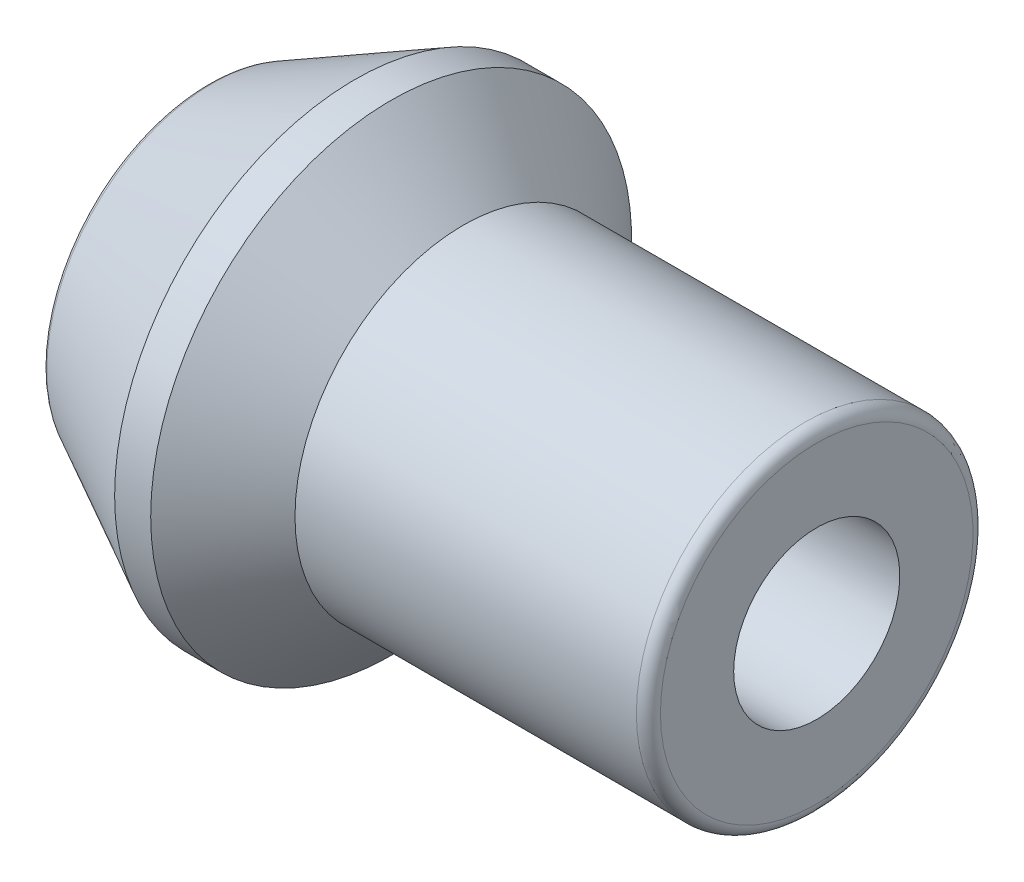
ISO-10303-21;
HEADER;
FILE_DESCRIPTION(('STEP AP214'),'2;1');
FILE_NAME('part.step','',(''),(''),'','','');
FILE_SCHEMA(('AUTOMOTIVE_DESIGN { 1 0 10303 214 1 1 1 1 }'));
ENDSEC;
DATA;
#1=APPLICATION_CONTEXT('core data for automotive mechanical design processes');
#2=APPLICATION_PROTOCOL_DEFINITION('international standard','automotive_design',2000,#1);
#3=PRODUCT_CONTEXT('',#1,'mechanical');
#4=PRODUCT('Part','Part','',(#3));
#5=PRODUCT_RELATED_PRODUCT_CATEGORY('part','',(#4));
#6=PRODUCT_DEFINITION_FORMATION('','',#4);
#7=PRODUCT_DEFINITION_CONTEXT('part definition',#1,'design');
#8=PRODUCT_DEFINITION('design','',#6,#7);
#9=PRODUCT_DEFINITION_SHAPE('','',#8);
#10=(LENGTH_UNIT() NAMED_UNIT(*) SI_UNIT(.MILLI.,.METRE.));
#11=(NAMED_UNIT(*) PLANE_ANGLE_UNIT() SI_UNIT($,.RADIAN.));
#12=(NAMED_UNIT(*) SI_UNIT($,.STERADIAN.) SOLID_ANGLE_UNIT());
#13=UNCERTAINTY_MEASURE_WITH_UNIT(LENGTH_MEASURE(1.E-05),#10,'distance_accuracy_value','');
#14=(GEOMETRIC_REPRESENTATION_CONTEXT(3) GLOBAL_UNCERTAINTY_ASSIGNED_CONTEXT((#13)) GLOBAL_UNIT_ASSIGNED_CONTEXT((#10,
#11,#12)) REPRESENTATION_CONTEXT('',''));
#15=CARTESIAN_POINT('',(0.,0.,0.));
#16=DIRECTION('',(0.,0.,1.));
#17=DIRECTION('',(1.,0.,0.));
#18=AXIS2_PLACEMENT_3D('',#15,#16,#17);
#19=CARTESIAN_POINT('',(0.,0.,0.));
#20=DIRECTION('',(1.,0.,0.));
#21=DIRECTION('',(0.,0.,-1.));
#22=AXIS2_PLACEMENT_3D('',#19,#20,#21);
#23=PLANE('',#22);
#24=CARTESIAN_POINT('',(0.,0.,0.));
#25=DIRECTION('',(-1.,0.,0.));
#26=DIRECTION('',(0.,0.,1.));
#27=AXIS2_PLACEMENT_3D('',#24,#25,#26);
#28=CIRCLE('',#27,3.4544);
#29=CARTESIAN_POINT('',(0.,0.,3.4544));
#30=VERTEX_POINT('',#29);
#31=EDGE_CURVE('E62',#30,#30,#28,.T.);
#32=ORIENTED_EDGE('',*,*,#31,.F.);
#33=EDGE_LOOP('',(#32));
#34=FACE_BOUND('',#33,.T.);
#35=CARTESIAN_POINT('',(0.,0.,0.));
#36=DIRECTION('',(-1.,0.,0.));
#37=DIRECTION('',(0.,0.,1.));
#38=AXIS2_PLACEMENT_3D('',#35,#36,#37);
#39=CIRCLE('',#38,6.44756624442331);
#40=CARTESIAN_POINT('',(0.,0.,6.44756624442331));
#41=VERTEX_POINT('',#40);
#42=EDGE_CURVE('E10',#41,#41,#39,.T.);
#43=ORIENTED_EDGE('',*,*,#42,.T.);
#44=EDGE_LOOP('',(#43));
#45=FACE_BOUND('',#44,.T.);
#46=ADVANCED_FACE('F31',(#34,#45),#23,.F.);
#47=CARTESIAN_POINT('',(0.5,0.,0.));
#48=DIRECTION('',(-1.,0.,0.));
#49=DIRECTION('',(0.,0.,1.));
#50=AXIS2_PLACEMENT_3D('',#47,#48,#49);
#51=TOROIDAL_SURFACE('',#50,6.44756624442331,0.5);
#52=ORIENTED_EDGE('',*,*,#42,.F.);
#53=EDGE_LOOP('',(#52));
#54=FACE_BOUND('',#53,.T.);
#55=CARTESIAN_POINT('',(0.267863064642205,0.,0.));
#56=DIRECTION('',(-1.,0.,0.));
#57=DIRECTION('',(0.,0.,1.));
#58=AXIS2_PLACEMENT_3D('',#55,#56,#57);
#59=CIRCLE('',#58,6.89041209033664);
#60=CARTESIAN_POINT('',(0.267863064642205,0.,6.89041209033664));
#61=VERTEX_POINT('',#60);
#62=EDGE_CURVE('E37',#61,#61,#59,.T.);
#63=ORIENTED_EDGE('',*,*,#62,.T.);
#64=EDGE_LOOP('',(#63));
#65=FACE_BOUND('',#64,.T.);
#66=ADVANCED_FACE('F69',(#54,#65),#51,.T.);
#67=CARTESIAN_POINT('',(6.19999999999998,0.,0.));
#68=DIRECTION('',(1.,0.,0.));
#69=DIRECTION('',(0.,0.,-1.));
#70=AXIS2_PLACEMENT_3D('',#67,#68,#69);
#71=CONICAL_SURFACE('',#70,10.,0.482814590584316);
#72=ORIENTED_EDGE('',*,*,#62,.F.);
#73=EDGE_LOOP('',(#72));
#74=FACE_BOUND('',#73,.T.);
#75=CARTESIAN_POINT('',(6.19999999999998,0.,0.));
#76=DIRECTION('',(-1.,0.,0.));
#77=DIRECTION('',(0.,0.,1.));
#78=AXIS2_PLACEMENT_3D('',#75,#76,#77);
#79=CIRCLE('',#78,10.);
#80=CARTESIAN_POINT('',(6.19999999999998,0.,10.));
#81=VERTEX_POINT('',#80);
#82=EDGE_CURVE('E41',#81,#81,#79,.T.);
#83=ORIENTED_EDGE('',*,*,#82,.T.);
#84=EDGE_LOOP('',(#83));
#85=FACE_BOUND('',#84,.T.);
#86=ADVANCED_FACE('F73',(#74,#85),#71,.T.);
#87=CARTESIAN_POINT('',(-16.6646757373758,0.,0.));
#88=DIRECTION('',(-1.,0.,0.));
#89=DIRECTION('',(0.,0.,1.));
#90=AXIS2_PLACEMENT_3D('',#87,#88,#89);
#91=CYLINDRICAL_SURFACE('',#90,10.);
#92=ORIENTED_EDGE('',*,*,#82,.F.);
#93=EDGE_LOOP('',(#92));
#94=FACE_BOUND('',#93,.T.);
#95=CARTESIAN_POINT('',(7.69999999999998,0.,0.));
#96=DIRECTION('',(-1.,0.,0.));
#97=DIRECTION('',(0.,0.,1.));
#98=AXIS2_PLACEMENT_3D('',#95,#96,#97);
#99=CIRCLE('',#98,10.);
#100=CARTESIAN_POINT('',(7.69999999999998,0.,10.));
#101=VERTEX_POINT('',#100);
#102=EDGE_CURVE('E45',#101,#101,#99,.T.);
#103=ORIENTED_EDGE('',*,*,#102,.T.);
#104=EDGE_LOOP('',(#103));
#105=FACE_BOUND('',#104,.T.);
#106=ADVANCED_FACE('F78',(#94,#105),#91,.T.);
#107=CARTESIAN_POINT('',(10.7,0.,0.));
#108=DIRECTION('',(-1.,0.,0.));
#109=DIRECTION('',(0.,0.,1.));
#110=AXIS2_PLACEMENT_3D('',#107,#108,#109);
#111=CONICAL_SURFACE('',#110,7.,0.785398163397444);
#112=ORIENTED_EDGE('',*,*,#102,.F.);
#113=EDGE_LOOP('',(#112));
#114=FACE_BOUND('',#113,.T.);
#115=CARTESIAN_POINT('',(10.7,0.,0.));
#116=DIRECTION('',(-1.,0.,0.));
#117=DIRECTION('',(0.,0.,1.));
#118=AXIS2_PLACEMENT_3D('',#115,#116,#117);
#119=CIRCLE('',#118,7.);
#120=CARTESIAN_POINT('',(10.7,0.,7.));
#121=VERTEX_POINT('',#120);
#122=EDGE_CURVE('E50',#121,#121,#119,.T.);
#123=ORIENTED_EDGE('',*,*,#122,.T.);
#124=EDGE_LOOP('',(#123));
#125=FACE_BOUND('',#124,.T.);
#126=ADVANCED_FACE('F84',(#114,#125),#111,.T.);
#127=CARTESIAN_POINT('',(-16.6646757373758,0.,0.));
#128=DIRECTION('',(-1.,0.,0.));
#129=DIRECTION('',(0.,0.,1.));
#130=AXIS2_PLACEMENT_3D('',#127,#128,#129);
#131=CYLINDRICAL_SURFACE('',#130,7.);
#132=ORIENTED_EDGE('',*,*,#122,.F.);
#133=EDGE_LOOP('',(#132));
#134=FACE_BOUND('',#133,.T.);
#135=CARTESIAN_POINT('',(24.9,0.,0.));
#136=DIRECTION('',(-1.,0.,0.));
#137=DIRECTION('',(0.,0.,1.));
#138=AXIS2_PLACEMENT_3D('',#135,#136,#137);
#139=CIRCLE('',#138,7.);
#140=CARTESIAN_POINT('',(24.9,0.,7.));
#141=VERTEX_POINT('',#140);
#142=EDGE_CURVE('E53',#141,#141,#139,.T.);
#143=ORIENTED_EDGE('',*,*,#142,.T.);
#144=EDGE_LOOP('',(#143));
#145=FACE_BOUND('',#144,.T.);
#146=ADVANCED_FACE('F88',(#134,#145),#131,.T.);
#147=CARTESIAN_POINT('',(24.9,0.,0.));
#148=DIRECTION('',(-1.,0.,0.));
#149=DIRECTION('',(0.,0.,1.));
#150=AXIS2_PLACEMENT_3D('',#147,#148,#149);
#151=TOROIDAL_SURFACE('',#150,6.5,0.5);
#152=ORIENTED_EDGE('',*,*,#142,.F.);
#153=EDGE_LOOP('',(#152));
#154=FACE_BOUND('',#153,.T.);
#155=CARTESIAN_POINT('',(25.4,0.,0.));
#156=DIRECTION('',(-1.,0.,0.));
#157=DIRECTION('',(0.,0.,1.));
#158=AXIS2_PLACEMENT_3D('',#155,#156,#157);
#159=CIRCLE('',#158,6.5);
#160=CARTESIAN_POINT('',(25.4,0.,6.5));
#161=VERTEX_POINT('',#160);
#162=EDGE_CURVE('E56',#161,#161,#159,.T.);
#163=ORIENTED_EDGE('',*,*,#162,.T.);
#164=EDGE_LOOP('',(#163));
#165=FACE_BOUND('',#164,.T.);
#166=ADVANCED_FACE('F92',(#154,#165),#151,.T.);
#167=CARTESIAN_POINT('',(25.4,6.5,0.));
#168=DIRECTION('',(-1.,0.,0.));
#169=DIRECTION('',(0.,0.,1.));
#170=AXIS2_PLACEMENT_3D('',#167,#168,#169);
#171=PLANE('',#170);
#172=CARTESIAN_POINT('',(25.4,0.,0.));
#173=DIRECTION('',(-1.,0.,0.));
#174=DIRECTION('',(0.,0.,1.));
#175=AXIS2_PLACEMENT_3D('',#172,#173,#174);
#176=CIRCLE('',#175,3.4544);
#177=CARTESIAN_POINT('',(25.4,0.,3.4544));
#178=VERTEX_POINT('',#177);
#179=EDGE_CURVE('E59',#178,#178,#176,.T.);
#180=ORIENTED_EDGE('',*,*,#179,.T.);
#181=EDGE_LOOP('',(#180));
#182=FACE_BOUND('',#181,.T.);
#183=ORIENTED_EDGE('',*,*,#162,.F.);
#184=EDGE_LOOP('',(#183));
#185=FACE_BOUND('',#184,.T.);
#186=ADVANCED_FACE('F96',(#182,#185),#171,.F.);
#187=CARTESIAN_POINT('',(0.,0.,0.));
#188=DIRECTION('',(-1.,0.,0.));
#189=DIRECTION('',(0.,0.,1.));
#190=AXIS2_PLACEMENT_3D('',#187,#188,#189);
#191=CYLINDRICAL_SURFACE('',#190,3.4544);
#192=ORIENTED_EDGE('',*,*,#179,.F.);
#193=EDGE_LOOP('',(#192));
#194=FACE_BOUND('',#193,.T.);
#195=ORIENTED_EDGE('',*,*,#31,.T.);
#196=EDGE_LOOP('',(#195));
#197=FACE_BOUND('',#196,.T.);
#198=ADVANCED_FACE('F66',(#194,#197),#191,.F.);
#199=CLOSED_SHELL('',(#46,#66,#86,#106,#126,#146,#166,#186,#198));
#200=MANIFOLD_SOLID_BREP('B2',#199);
#201=ADVANCED_BREP_SHAPE_REPRESENTATION('',(#18,#200),#14);
#202=SHAPE_DEFINITION_REPRESENTATION(#9,#201);
ENDSEC;
END-ISO-10303-21;
